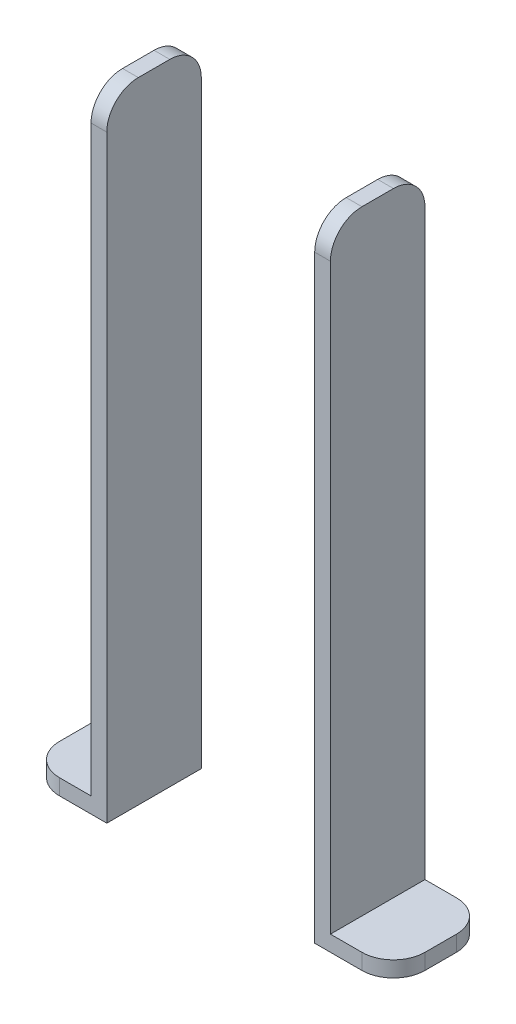
ISO-10303-21;
HEADER;
FILE_DESCRIPTION(('STEP AP214'),'2;1');
FILE_NAME('part.step','',(''),(''),'','','');
FILE_SCHEMA(('AUTOMOTIVE_DESIGN { 1 0 10303 214 1 1 1 1 }'));
ENDSEC;
DATA;
#1=APPLICATION_CONTEXT('core data for automotive mechanical design processes');
#2=APPLICATION_PROTOCOL_DEFINITION('international standard','automotive_design',2000,#1);
#3=PRODUCT_CONTEXT('',#1,'mechanical');
#4=PRODUCT('Part','Part','',(#3));
#5=PRODUCT_RELATED_PRODUCT_CATEGORY('part','',(#4));
#6=PRODUCT_DEFINITION_FORMATION('','',#4);
#7=PRODUCT_DEFINITION_CONTEXT('part definition',#1,'design');
#8=PRODUCT_DEFINITION('design','',#6,#7);
#9=PRODUCT_DEFINITION_SHAPE('','',#8);
#10=(LENGTH_UNIT() NAMED_UNIT(*) SI_UNIT(.MILLI.,.METRE.));
#11=(NAMED_UNIT(*) PLANE_ANGLE_UNIT() SI_UNIT($,.RADIAN.));
#12=(NAMED_UNIT(*) SI_UNIT($,.STERADIAN.) SOLID_ANGLE_UNIT());
#13=UNCERTAINTY_MEASURE_WITH_UNIT(LENGTH_MEASURE(1.E-05),#10,'distance_accuracy_value','');
#14=(GEOMETRIC_REPRESENTATION_CONTEXT(3) GLOBAL_UNCERTAINTY_ASSIGNED_CONTEXT((#13)) GLOBAL_UNIT_ASSIGNED_CONTEXT((#10,
#11,#12)) REPRESENTATION_CONTEXT('',''));
#15=CARTESIAN_POINT('',(0.,0.,0.));
#16=DIRECTION('',(0.,0.,1.));
#17=DIRECTION('',(1.,0.,0.));
#18=AXIS2_PLACEMENT_3D('',#15,#16,#17);
#19=CARTESIAN_POINT('',(-38.,-95.,-15.));
#20=DIRECTION('',(-1.,0.,0.));
#21=DIRECTION('',(0.,-1.,0.));
#22=AXIS2_PLACEMENT_3D('',#19,#20,#21);
#23=PLANE('',#22);
#24=DIRECTION('',(0.,0.,1.));
#25=VECTOR('',#24,1.);
#26=CARTESIAN_POINT('',(-38.,100.,-15.));
#27=LINE('',#26,#25);
#28=CARTESIAN_POINT('',(-38.,100.,-5.));
#29=VERTEX_POINT('',#28);
#30=CARTESIAN_POINT('',(-38.,100.,5.));
#31=VERTEX_POINT('',#30);
#32=EDGE_CURVE('E162',#29,#31,#27,.T.);
#33=ORIENTED_EDGE('',*,*,#32,.F.);
#34=CARTESIAN_POINT('',(-38.,90.,-5.));
#35=DIRECTION('',(-1.,0.,0.));
#36=DIRECTION('',(0.,-1.,0.));
#37=AXIS2_PLACEMENT_3D('',#34,#35,#36);
#38=CIRCLE('',#37,10.);
#39=CARTESIAN_POINT('',(-38.,90.,-15.));
#40=VERTEX_POINT('',#39);
#41=EDGE_CURVE('E198',#29,#40,#38,.T.);
#42=ORIENTED_EDGE('',*,*,#41,.T.);
#43=DIRECTION('',(0.,-1.,0.));
#44=VECTOR('',#43,1.);
#45=CARTESIAN_POINT('',(-38.,-95.,-15.));
#46=LINE('',#45,#44);
#47=CARTESIAN_POINT('',(-38.,-95.,-15.));
#48=VERTEX_POINT('',#47);
#49=EDGE_CURVE('E139',#40,#48,#46,.T.);
#50=ORIENTED_EDGE('',*,*,#49,.T.);
#51=DIRECTION('',(0.,0.,1.));
#52=VECTOR('',#51,1.);
#53=CARTESIAN_POINT('',(-38.,-95.,-15.));
#54=LINE('',#53,#52);
#55=CARTESIAN_POINT('',(-38.,-95.,15.));
#56=VERTEX_POINT('',#55);
#57=EDGE_CURVE('E136',#48,#56,#54,.T.);
#58=ORIENTED_EDGE('',*,*,#57,.T.);
#59=DIRECTION('',(0.,-1.,0.));
#60=VECTOR('',#59,1.);
#61=CARTESIAN_POINT('',(-38.,-95.,15.));
#62=LINE('',#61,#60);
#63=CARTESIAN_POINT('',(-38.,90.,15.));
#64=VERTEX_POINT('',#63);
#65=EDGE_CURVE('E123',#64,#56,#62,.T.);
#66=ORIENTED_EDGE('',*,*,#65,.F.);
#67=CARTESIAN_POINT('',(-38.,90.,5.));
#68=DIRECTION('',(-1.,0.,0.));
#69=DIRECTION('',(0.,-1.,0.));
#70=AXIS2_PLACEMENT_3D('',#67,#68,#69);
#71=CIRCLE('',#70,10.);
#72=EDGE_CURVE('E196',#64,#31,#71,.T.);
#73=ORIENTED_EDGE('',*,*,#72,.T.);
#74=EDGE_LOOP('',(#33,#42,#50,#58,#66,#73));
#75=FACE_BOUND('',#74,.T.);
#76=ADVANCED_FACE('F45',(#75),#23,.T.);
#77=CARTESIAN_POINT('',(-38.,100.,-15.));
#78=DIRECTION('',(0.,1.,0.));
#79=DIRECTION('',(0.,0.,1.));
#80=AXIS2_PLACEMENT_3D('',#77,#78,#79);
#81=PLANE('',#80);
#82=DIRECTION('',(0.,0.,1.));
#83=VECTOR('',#82,1.);
#84=CARTESIAN_POINT('',(-33.,100.,-15.));
#85=LINE('',#84,#83);
#86=CARTESIAN_POINT('',(-33.,100.,-5.));
#87=VERTEX_POINT('',#86);
#88=CARTESIAN_POINT('',(-33.,100.,5.));
#89=VERTEX_POINT('',#88);
#90=EDGE_CURVE('E165',#87,#89,#85,.T.);
#91=ORIENTED_EDGE('',*,*,#90,.F.);
#92=DIRECTION('',(-1.,0.,0.));
#93=VECTOR('',#92,1.);
#94=CARTESIAN_POINT('',(-38.,100.,-5.));
#95=LINE('',#94,#93);
#96=EDGE_CURVE('E193',#87,#29,#95,.T.);
#97=ORIENTED_EDGE('',*,*,#96,.T.);
#98=ORIENTED_EDGE('',*,*,#32,.T.);
#99=DIRECTION('',(-1.,0.,0.));
#100=VECTOR('',#99,1.);
#101=CARTESIAN_POINT('',(-33.,100.,5.));
#102=LINE('',#101,#100);
#103=EDGE_CURVE('E60',#31,#89,#102,.F.);
#104=ORIENTED_EDGE('',*,*,#103,.T.);
#105=EDGE_LOOP('',(#91,#97,#98,#104));
#106=FACE_BOUND('',#105,.T.);
#107=ADVANCED_FACE('F205',(#106),#81,.T.);
#108=CARTESIAN_POINT('',(-33.,100.,-15.));
#109=DIRECTION('',(1.,0.,0.));
#110=DIRECTION('',(0.,0.,-1.));
#111=AXIS2_PLACEMENT_3D('',#108,#109,#110);
#112=PLANE('',#111);
#113=DIRECTION('',(0.,1.,0.));
#114=VECTOR('',#113,1.);
#115=CARTESIAN_POINT('',(-33.,100.,-15.));
#116=LINE('',#115,#114);
#117=CARTESIAN_POINT('',(-33.,-100.,-15.));
#118=VERTEX_POINT('',#117);
#119=CARTESIAN_POINT('',(-33.,90.,-15.));
#120=VERTEX_POINT('',#119);
#121=EDGE_CURVE('E144',#118,#120,#116,.T.);
#122=ORIENTED_EDGE('',*,*,#121,.T.);
#123=CARTESIAN_POINT('',(-33.,90.,-5.));
#124=DIRECTION('',(1.,0.,0.));
#125=DIRECTION('',(0.,0.,-1.));
#126=AXIS2_PLACEMENT_3D('',#123,#124,#125);
#127=CIRCLE('',#126,10.);
#128=EDGE_CURVE('E12',#120,#87,#127,.T.);
#129=ORIENTED_EDGE('',*,*,#128,.T.);
#130=ORIENTED_EDGE('',*,*,#90,.T.);
#131=CARTESIAN_POINT('',(-33.,90.,5.));
#132=DIRECTION('',(1.,0.,0.));
#133=DIRECTION('',(0.,0.,-1.));
#134=AXIS2_PLACEMENT_3D('',#131,#132,#133);
#135=CIRCLE('',#134,10.);
#136=CARTESIAN_POINT('',(-33.,90.,15.));
#137=VERTEX_POINT('',#136);
#138=EDGE_CURVE('E53',#89,#137,#135,.T.);
#139=ORIENTED_EDGE('',*,*,#138,.T.);
#140=DIRECTION('',(0.,1.,0.));
#141=VECTOR('',#140,1.);
#142=CARTESIAN_POINT('',(-33.,100.,15.));
#143=LINE('',#142,#141);
#144=CARTESIAN_POINT('',(-33.,-100.,15.));
#145=VERTEX_POINT('',#144);
#146=EDGE_CURVE('E152',#145,#137,#143,.T.);
#147=ORIENTED_EDGE('',*,*,#146,.F.);
#148=DIRECTION('',(0.,0.,1.));
#149=VECTOR('',#148,1.);
#150=CARTESIAN_POINT('',(-33.,-100.,-15.));
#151=LINE('',#150,#149);
#152=EDGE_CURVE('E167',#118,#145,#151,.T.);
#153=ORIENTED_EDGE('',*,*,#152,.F.);
#154=EDGE_LOOP('',(#122,#129,#130,#139,#147,#153));
#155=FACE_BOUND('',#154,.T.);
#156=ADVANCED_FACE('F201',(#155),#112,.T.);
#157=CARTESIAN_POINT('',(-33.,-100.,-15.));
#158=DIRECTION('',(0.,-1.,0.));
#159=DIRECTION('',(1.,0.,0.));
#160=AXIS2_PLACEMENT_3D('',#157,#158,#159);
#161=PLANE('',#160);
#162=DIRECTION('',(0.,0.,1.));
#163=VECTOR('',#162,1.);
#164=CARTESIAN_POINT('',(-58.,-100.,-15.));
#165=LINE('',#164,#163);
#166=CARTESIAN_POINT('',(-58.,-100.,-5.));
#167=VERTEX_POINT('',#166);
#168=CARTESIAN_POINT('',(-58.,-100.,5.));
#169=VERTEX_POINT('',#168);
#170=EDGE_CURVE('E170',#167,#169,#165,.T.);
#171=ORIENTED_EDGE('',*,*,#170,.F.);
#172=CARTESIAN_POINT('',(-48.,-100.,-5.));
#173=DIRECTION('',(0.,-1.,0.));
#174=DIRECTION('',(1.,0.,0.));
#175=AXIS2_PLACEMENT_3D('',#172,#173,#174);
#176=CIRCLE('',#175,10.);
#177=CARTESIAN_POINT('',(-48.,-100.,-15.));
#178=VERTEX_POINT('',#177);
#179=EDGE_CURVE('E180',#167,#178,#176,.T.);
#180=ORIENTED_EDGE('',*,*,#179,.T.);
#181=DIRECTION('',(1.,0.,0.));
#182=VECTOR('',#181,1.);
#183=CARTESIAN_POINT('',(-33.,-100.,-15.));
#184=LINE('',#183,#182);
#185=EDGE_CURVE('E159',#178,#118,#184,.T.);
#186=ORIENTED_EDGE('',*,*,#185,.T.);
#187=ORIENTED_EDGE('',*,*,#152,.T.);
#188=DIRECTION('',(1.,0.,0.));
#189=VECTOR('',#188,1.);
#190=CARTESIAN_POINT('',(-33.,-100.,15.));
#191=LINE('',#190,#189);
#192=CARTESIAN_POINT('',(-48.,-100.,15.));
#193=VERTEX_POINT('',#192);
#194=EDGE_CURVE('E150',#193,#145,#191,.T.);
#195=ORIENTED_EDGE('',*,*,#194,.F.);
#196=CARTESIAN_POINT('',(-48.,-100.,5.));
#197=DIRECTION('',(0.,-1.,0.));
#198=DIRECTION('',(1.,0.,0.));
#199=AXIS2_PLACEMENT_3D('',#196,#197,#198);
#200=CIRCLE('',#199,10.);
#201=EDGE_CURVE('E178',#193,#169,#200,.T.);
#202=ORIENTED_EDGE('',*,*,#201,.T.);
#203=EDGE_LOOP('',(#171,#180,#186,#187,#195,#202));
#204=FACE_BOUND('',#203,.T.);
#205=ADVANCED_FACE('F225',(#204),#161,.T.);
#206=CARTESIAN_POINT('',(-58.,-100.,-15.));
#207=DIRECTION('',(-1.,0.,0.));
#208=DIRECTION('',(0.,-1.,0.));
#209=AXIS2_PLACEMENT_3D('',#206,#207,#208);
#210=PLANE('',#209);
#211=DIRECTION('',(0.,0.,1.));
#212=VECTOR('',#211,1.);
#213=CARTESIAN_POINT('',(-58.,-95.,-15.));
#214=LINE('',#213,#212);
#215=CARTESIAN_POINT('',(-58.,-95.,-5.));
#216=VERTEX_POINT('',#215);
#217=CARTESIAN_POINT('',(-58.,-95.,5.));
#218=VERTEX_POINT('',#217);
#219=EDGE_CURVE('E143',#216,#218,#214,.T.);
#220=ORIENTED_EDGE('',*,*,#219,.F.);
#221=DIRECTION('',(0.,-1.,0.));
#222=VECTOR('',#221,1.);
#223=CARTESIAN_POINT('',(-58.,-100.,-5.));
#224=LINE('',#223,#222);
#225=EDGE_CURVE('E175',#216,#167,#224,.T.);
#226=ORIENTED_EDGE('',*,*,#225,.T.);
#227=ORIENTED_EDGE('',*,*,#170,.T.);
#228=DIRECTION('',(0.,-1.,0.));
#229=VECTOR('',#228,1.);
#230=CARTESIAN_POINT('',(-58.,-95.,5.));
#231=LINE('',#230,#229);
#232=EDGE_CURVE('E164',#169,#218,#231,.F.);
#233=ORIENTED_EDGE('',*,*,#232,.T.);
#234=EDGE_LOOP('',(#220,#226,#227,#233));
#235=FACE_BOUND('',#234,.T.);
#236=ADVANCED_FACE('F222',(#235),#210,.T.);
#237=CARTESIAN_POINT('',(-58.,-95.,-15.));
#238=DIRECTION('',(0.,1.,0.));
#239=DIRECTION('',(0.,0.,1.));
#240=AXIS2_PLACEMENT_3D('',#237,#238,#239);
#241=PLANE('',#240);
#242=DIRECTION('',(-1.,0.,0.));
#243=VECTOR('',#242,1.);
#244=CARTESIAN_POINT('',(-58.,-95.,-15.));
#245=LINE('',#244,#243);
#246=CARTESIAN_POINT('',(-48.,-95.,-15.));
#247=VERTEX_POINT('',#246);
#248=EDGE_CURVE('E157',#48,#247,#245,.T.);
#249=ORIENTED_EDGE('',*,*,#248,.T.);
#250=CARTESIAN_POINT('',(-48.,-95.,-5.));
#251=DIRECTION('',(0.,1.,0.));
#252=DIRECTION('',(0.,0.,1.));
#253=AXIS2_PLACEMENT_3D('',#250,#251,#252);
#254=CIRCLE('',#253,10.);
#255=EDGE_CURVE('E187',#247,#216,#254,.T.);
#256=ORIENTED_EDGE('',*,*,#255,.T.);
#257=ORIENTED_EDGE('',*,*,#219,.T.);
#258=CARTESIAN_POINT('',(-48.,-95.,5.));
#259=DIRECTION('',(0.,1.,0.));
#260=DIRECTION('',(0.,0.,1.));
#261=AXIS2_PLACEMENT_3D('',#258,#259,#260);
#262=CIRCLE('',#261,10.);
#263=CARTESIAN_POINT('',(-48.,-95.,15.));
#264=VERTEX_POINT('',#263);
#265=EDGE_CURVE('E149',#218,#264,#262,.T.);
#266=ORIENTED_EDGE('',*,*,#265,.T.);
#267=DIRECTION('',(-1.,0.,0.));
#268=VECTOR('',#267,1.);
#269=CARTESIAN_POINT('',(-58.,-95.,15.));
#270=LINE('',#269,#268);
#271=EDGE_CURVE('E128',#56,#264,#270,.T.);
#272=ORIENTED_EDGE('',*,*,#271,.F.);
#273=ORIENTED_EDGE('',*,*,#57,.F.);
#274=EDGE_LOOP('',(#249,#256,#257,#266,#272,#273));
#275=FACE_BOUND('',#274,.T.);
#276=ADVANCED_FACE('F146',(#275),#241,.T.);
#277=CARTESIAN_POINT('',(0.,0.,-15.));
#278=DIRECTION('',(0.,0.,-1.));
#279=DIRECTION('',(-1.,0.,0.));
#280=AXIS2_PLACEMENT_3D('',#277,#278,#279);
#281=PLANE('',#280);
#282=ORIENTED_EDGE('',*,*,#185,.F.);
#283=DIRECTION('',(0.,-1.,0.));
#284=VECTOR('',#283,1.);
#285=CARTESIAN_POINT('',(-47.9999999999998,0.,-15.));
#286=LINE('',#285,#284);
#287=EDGE_CURVE('E184',#178,#247,#286,.F.);
#288=ORIENTED_EDGE('',*,*,#287,.T.);
#289=ORIENTED_EDGE('',*,*,#248,.F.);
#290=ORIENTED_EDGE('',*,*,#49,.F.);
#291=DIRECTION('',(-1.,0.,0.));
#292=VECTOR('',#291,1.);
#293=CARTESIAN_POINT('',(0.,90.,-15.));
#294=LINE('',#293,#292);
#295=EDGE_CURVE('E182',#40,#120,#294,.F.);
#296=ORIENTED_EDGE('',*,*,#295,.T.);
#297=ORIENTED_EDGE('',*,*,#121,.F.);
#298=EDGE_LOOP('',(#282,#288,#289,#290,#296,#297));
#299=FACE_BOUND('',#298,.T.);
#300=ADVANCED_FACE('F212',(#299),#281,.T.);
#301=CARTESIAN_POINT('',(0.,0.,15.));
#302=DIRECTION('',(0.,0.,-1.));
#303=DIRECTION('',(-1.,0.,0.));
#304=AXIS2_PLACEMENT_3D('',#301,#302,#303);
#305=PLANE('',#304);
#306=ORIENTED_EDGE('',*,*,#271,.T.);
#307=DIRECTION('',(0.,-1.,0.));
#308=VECTOR('',#307,1.);
#309=CARTESIAN_POINT('',(-48.,-100.,15.));
#310=LINE('',#309,#308);
#311=EDGE_CURVE('E190',#264,#193,#310,.T.);
#312=ORIENTED_EDGE('',*,*,#311,.T.);
#313=ORIENTED_EDGE('',*,*,#194,.T.);
#314=ORIENTED_EDGE('',*,*,#146,.T.);
#315=DIRECTION('',(-1.,0.,0.));
#316=VECTOR('',#315,1.);
#317=CARTESIAN_POINT('',(-38.,90.,15.));
#318=LINE('',#317,#316);
#319=EDGE_CURVE('E132',#137,#64,#318,.T.);
#320=ORIENTED_EDGE('',*,*,#319,.T.);
#321=ORIENTED_EDGE('',*,*,#65,.T.);
#322=EDGE_LOOP('',(#306,#312,#313,#314,#320,#321));
#323=FACE_BOUND('',#322,.T.);
#324=ADVANCED_FACE('F125',(#323),#305,.F.);
#325=CARTESIAN_POINT('',(-48.,-100.,-5.));
#326=DIRECTION('',(0.,-1.,0.));
#327=DIRECTION('',(1.,0.,0.));
#328=AXIS2_PLACEMENT_3D('',#325,#326,#327);
#329=CYLINDRICAL_SURFACE('',#328,10.);
#330=ORIENTED_EDGE('',*,*,#255,.F.);
#331=ORIENTED_EDGE('',*,*,#287,.F.);
#332=ORIENTED_EDGE('',*,*,#179,.F.);
#333=ORIENTED_EDGE('',*,*,#225,.F.);
#334=EDGE_LOOP('',(#330,#331,#332,#333));
#335=FACE_BOUND('',#334,.T.);
#336=ADVANCED_FACE('F219',(#335),#329,.T.);
#337=CARTESIAN_POINT('',(-47.9999999999998,0.,5.));
#338=DIRECTION('',(0.,1.,0.));
#339=DIRECTION('',(-1.,0.,0.));
#340=AXIS2_PLACEMENT_3D('',#337,#338,#339);
#341=CYLINDRICAL_SURFACE('',#340,10.);
#342=ORIENTED_EDGE('',*,*,#265,.F.);
#343=ORIENTED_EDGE('',*,*,#232,.F.);
#344=ORIENTED_EDGE('',*,*,#201,.F.);
#345=ORIENTED_EDGE('',*,*,#311,.F.);
#346=EDGE_LOOP('',(#342,#343,#344,#345));
#347=FACE_BOUND('',#346,.T.);
#348=ADVANCED_FACE('F227',(#347),#341,.T.);
#349=CARTESIAN_POINT('',(-38.,90.,-5.));
#350=DIRECTION('',(-1.,0.,0.));
#351=DIRECTION('',(0.,0.,1.));
#352=AXIS2_PLACEMENT_3D('',#349,#350,#351);
#353=CYLINDRICAL_SURFACE('',#352,10.);
#354=ORIENTED_EDGE('',*,*,#128,.F.);
#355=ORIENTED_EDGE('',*,*,#295,.F.);
#356=ORIENTED_EDGE('',*,*,#41,.F.);
#357=ORIENTED_EDGE('',*,*,#96,.F.);
#358=EDGE_LOOP('',(#354,#355,#356,#357));
#359=FACE_BOUND('',#358,.T.);
#360=ADVANCED_FACE('F208',(#359),#353,.T.);
#361=CARTESIAN_POINT('',(0.,90.,5.));
#362=DIRECTION('',(1.,0.,0.));
#363=DIRECTION('',(0.,0.,-1.));
#364=AXIS2_PLACEMENT_3D('',#361,#362,#363);
#365=CYLINDRICAL_SURFACE('',#364,10.);
#366=ORIENTED_EDGE('',*,*,#138,.F.);
#367=ORIENTED_EDGE('',*,*,#103,.F.);
#368=ORIENTED_EDGE('',*,*,#72,.F.);
#369=ORIENTED_EDGE('',*,*,#319,.F.);
#370=EDGE_LOOP('',(#366,#367,#368,#369));
#371=FACE_BOUND('',#370,.T.);
#372=ADVANCED_FACE('F47',(#371),#365,.T.);
#373=CLOSED_SHELL('',(#76,#107,#156,#205,#236,#276,#300,#324,#336,#348,#360,#372));
#374=MANIFOLD_SOLID_BREP('B2',#373);
#375=CARTESIAN_POINT('',(38.,100.,-15.));
#376=DIRECTION('',(0.,1.,0.));
#377=DIRECTION('',(0.,0.,1.));
#378=AXIS2_PLACEMENT_3D('',#375,#376,#377);
#379=PLANE('',#378);
#380=DIRECTION('',(0.,0.,1.));
#381=VECTOR('',#380,1.);
#382=CARTESIAN_POINT('',(38.,100.,-15.));
#383=LINE('',#382,#381);
#384=CARTESIAN_POINT('',(38.,100.,-5.));
#385=VERTEX_POINT('',#384);
#386=CARTESIAN_POINT('',(38.,100.,5.));
#387=VERTEX_POINT('',#386);
#388=EDGE_CURVE('E444',#385,#387,#383,.T.);
#389=ORIENTED_EDGE('',*,*,#388,.F.);
#390=DIRECTION('',(-1.,0.,0.));
#391=VECTOR('',#390,1.);
#392=CARTESIAN_POINT('',(33.,100.,-5.));
#393=LINE('',#392,#391);
#394=CARTESIAN_POINT('',(33.,100.,-5.));
#395=VERTEX_POINT('',#394);
#396=EDGE_CURVE('E474',#385,#395,#393,.T.);
#397=ORIENTED_EDGE('',*,*,#396,.T.);
#398=DIRECTION('',(0.,0.,1.));
#399=VECTOR('',#398,1.);
#400=CARTESIAN_POINT('',(33.,100.,-15.));
#401=LINE('',#400,#399);
#402=CARTESIAN_POINT('',(33.,100.,5.));
#403=VERTEX_POINT('',#402);
#404=EDGE_CURVE('E425',#395,#403,#401,.T.);
#405=ORIENTED_EDGE('',*,*,#404,.T.);
#406=DIRECTION('',(-1.,0.,0.));
#407=VECTOR('',#406,1.);
#408=CARTESIAN_POINT('',(38.,100.,5.));
#409=LINE('',#408,#407);
#410=EDGE_CURVE('E340',#403,#387,#409,.F.);
#411=ORIENTED_EDGE('',*,*,#410,.T.);
#412=EDGE_LOOP('',(#389,#397,#405,#411));
#413=FACE_BOUND('',#412,.T.);
#414=ADVANCED_FACE('F325',(#413),#379,.T.);
#415=CARTESIAN_POINT('',(38.,-95.,-15.));
#416=DIRECTION('',(1.,0.,0.));
#417=DIRECTION('',(0.,0.,-1.));
#418=AXIS2_PLACEMENT_3D('',#415,#416,#417);
#419=PLANE('',#418);
#420=DIRECTION('',(0.,1.,0.));
#421=VECTOR('',#420,1.);
#422=CARTESIAN_POINT('',(38.,-95.,-15.));
#423=LINE('',#422,#421);
#424=CARTESIAN_POINT('',(38.,-95.,-15.));
#425=VERTEX_POINT('',#424);
#426=CARTESIAN_POINT('',(38.,90.,-15.));
#427=VERTEX_POINT('',#426);
#428=EDGE_CURVE('E442',#425,#427,#423,.T.);
#429=ORIENTED_EDGE('',*,*,#428,.T.);
#430=CARTESIAN_POINT('',(38.,90.,-5.));
#431=DIRECTION('',(1.,0.,0.));
#432=DIRECTION('',(0.,0.,-1.));
#433=AXIS2_PLACEMENT_3D('',#430,#431,#432);
#434=CIRCLE('',#433,10.);
#435=EDGE_CURVE('E43',#427,#385,#434,.T.);
#436=ORIENTED_EDGE('',*,*,#435,.T.);
#437=ORIENTED_EDGE('',*,*,#388,.T.);
#438=CARTESIAN_POINT('',(38.,90.,5.));
#439=DIRECTION('',(1.,0.,0.));
#440=DIRECTION('',(0.,0.,-1.));
#441=AXIS2_PLACEMENT_3D('',#438,#439,#440);
#442=CIRCLE('',#441,10.);
#443=CARTESIAN_POINT('',(38.,90.,15.));
#444=VERTEX_POINT('',#443);
#445=EDGE_CURVE('E333',#387,#444,#442,.T.);
#446=ORIENTED_EDGE('',*,*,#445,.T.);
#447=DIRECTION('',(0.,1.,0.));
#448=VECTOR('',#447,1.);
#449=CARTESIAN_POINT('',(38.,-95.,15.));
#450=LINE('',#449,#448);
#451=CARTESIAN_POINT('',(38.,-95.,15.));
#452=VERTEX_POINT('',#451);
#453=EDGE_CURVE('E433',#452,#444,#450,.T.);
#454=ORIENTED_EDGE('',*,*,#453,.F.);
#455=DIRECTION('',(0.,0.,1.));
#456=VECTOR('',#455,1.);
#457=CARTESIAN_POINT('',(38.,-95.,-15.));
#458=LINE('',#457,#456);
#459=EDGE_CURVE('E447',#425,#452,#458,.T.);
#460=ORIENTED_EDGE('',*,*,#459,.F.);
#461=EDGE_LOOP('',(#429,#436,#437,#446,#454,#460));
#462=FACE_BOUND('',#461,.T.);
#463=ADVANCED_FACE('F482',(#462),#419,.T.);
#464=CARTESIAN_POINT('',(58.,-95.,-15.));
#465=DIRECTION('',(0.,1.,0.));
#466=DIRECTION('',(0.,0.,1.));
#467=AXIS2_PLACEMENT_3D('',#464,#465,#466);
#468=PLANE('',#467);
#469=DIRECTION('',(0.,0.,1.));
#470=VECTOR('',#469,1.);
#471=CARTESIAN_POINT('',(58.,-95.,-15.));
#472=LINE('',#471,#470);
#473=CARTESIAN_POINT('',(58.,-95.,-5.));
#474=VERTEX_POINT('',#473);
#475=CARTESIAN_POINT('',(58.,-95.,5.));
#476=VERTEX_POINT('',#475);
#477=EDGE_CURVE('E450',#474,#476,#472,.T.);
#478=ORIENTED_EDGE('',*,*,#477,.F.);
#479=CARTESIAN_POINT('',(48.,-95.,-5.));
#480=DIRECTION('',(0.,1.,0.));
#481=DIRECTION('',(0.,0.,1.));
#482=AXIS2_PLACEMENT_3D('',#479,#480,#481);
#483=CIRCLE('',#482,10.);
#484=CARTESIAN_POINT('',(48.,-95.,-15.));
#485=VERTEX_POINT('',#484);
#486=EDGE_CURVE('E461',#474,#485,#483,.T.);
#487=ORIENTED_EDGE('',*,*,#486,.T.);
#488=DIRECTION('',(-1.,0.,0.));
#489=VECTOR('',#488,1.);
#490=CARTESIAN_POINT('',(58.,-95.,-15.));
#491=LINE('',#490,#489);
#492=EDGE_CURVE('E440',#485,#425,#491,.T.);
#493=ORIENTED_EDGE('',*,*,#492,.T.);
#494=ORIENTED_EDGE('',*,*,#459,.T.);
#495=DIRECTION('',(-1.,0.,0.));
#496=VECTOR('',#495,1.);
#497=CARTESIAN_POINT('',(58.,-95.,15.));
#498=LINE('',#497,#496);
#499=CARTESIAN_POINT('',(48.,-95.,15.));
#500=VERTEX_POINT('',#499);
#501=EDGE_CURVE('E431',#500,#452,#498,.T.);
#502=ORIENTED_EDGE('',*,*,#501,.F.);
#503=CARTESIAN_POINT('',(48.,-95.,5.));
#504=DIRECTION('',(0.,1.,0.));
#505=DIRECTION('',(0.,0.,1.));
#506=AXIS2_PLACEMENT_3D('',#503,#504,#505);
#507=CIRCLE('',#506,10.);
#508=EDGE_CURVE('E459',#500,#476,#507,.T.);
#509=ORIENTED_EDGE('',*,*,#508,.T.);
#510=EDGE_LOOP('',(#478,#487,#493,#494,#502,#509));
#511=FACE_BOUND('',#510,.T.);
#512=ADVANCED_FACE('F505',(#511),#468,.T.);
#513=CARTESIAN_POINT('',(58.,-100.,-15.));
#514=DIRECTION('',(1.,0.,0.));
#515=DIRECTION('',(0.,1.,0.));
#516=AXIS2_PLACEMENT_3D('',#513,#514,#515);
#517=PLANE('',#516);
#518=DIRECTION('',(0.,0.,1.));
#519=VECTOR('',#518,1.);
#520=CARTESIAN_POINT('',(58.,-100.,-15.));
#521=LINE('',#520,#519);
#522=CARTESIAN_POINT('',(58.,-100.,-5.));
#523=VERTEX_POINT('',#522);
#524=CARTESIAN_POINT('',(58.,-100.,5.));
#525=VERTEX_POINT('',#524);
#526=EDGE_CURVE('E424',#523,#525,#521,.T.);
#527=ORIENTED_EDGE('',*,*,#526,.F.);
#528=DIRECTION('',(0.,1.,0.));
#529=VECTOR('',#528,1.);
#530=CARTESIAN_POINT('',(58.,-95.,-5.));
#531=LINE('',#530,#529);
#532=EDGE_CURVE('E456',#523,#474,#531,.T.);
#533=ORIENTED_EDGE('',*,*,#532,.T.);
#534=ORIENTED_EDGE('',*,*,#477,.T.);
#535=DIRECTION('',(0.,1.,0.));
#536=VECTOR('',#535,1.);
#537=CARTESIAN_POINT('',(58.,-100.,5.));
#538=LINE('',#537,#536);
#539=EDGE_CURVE('E446',#476,#525,#538,.F.);
#540=ORIENTED_EDGE('',*,*,#539,.T.);
#541=EDGE_LOOP('',(#527,#533,#534,#540));
#542=FACE_BOUND('',#541,.T.);
#543=ADVANCED_FACE('F502',(#542),#517,.T.);
#544=CARTESIAN_POINT('',(33.,-100.,-15.));
#545=DIRECTION('',(0.,-1.,0.));
#546=DIRECTION('',(0.,0.,-1.));
#547=AXIS2_PLACEMENT_3D('',#544,#545,#546);
#548=PLANE('',#547);
#549=DIRECTION('',(1.,0.,0.));
#550=VECTOR('',#549,1.);
#551=CARTESIAN_POINT('',(33.,-100.,-15.));
#552=LINE('',#551,#550);
#553=CARTESIAN_POINT('',(33.,-100.,-15.));
#554=VERTEX_POINT('',#553);
#555=CARTESIAN_POINT('',(48.,-100.,-15.));
#556=VERTEX_POINT('',#555);
#557=EDGE_CURVE('E438',#554,#556,#552,.T.);
#558=ORIENTED_EDGE('',*,*,#557,.T.);
#559=CARTESIAN_POINT('',(48.,-100.,-5.));
#560=DIRECTION('',(0.,-1.,0.));
#561=DIRECTION('',(0.,0.,-1.));
#562=AXIS2_PLACEMENT_3D('',#559,#560,#561);
#563=CIRCLE('',#562,10.);
#564=EDGE_CURVE('E468',#556,#523,#563,.T.);
#565=ORIENTED_EDGE('',*,*,#564,.T.);
#566=ORIENTED_EDGE('',*,*,#526,.T.);
#567=CARTESIAN_POINT('',(48.,-100.,5.));
#568=DIRECTION('',(0.,-1.,0.));
#569=DIRECTION('',(0.,0.,-1.));
#570=AXIS2_PLACEMENT_3D('',#567,#568,#569);
#571=CIRCLE('',#570,10.);
#572=CARTESIAN_POINT('',(48.,-100.,15.));
#573=VERTEX_POINT('',#572);
#574=EDGE_CURVE('E430',#525,#573,#571,.T.);
#575=ORIENTED_EDGE('',*,*,#574,.T.);
#576=DIRECTION('',(1.,0.,0.));
#577=VECTOR('',#576,1.);
#578=CARTESIAN_POINT('',(33.,-100.,15.));
#579=LINE('',#578,#577);
#580=CARTESIAN_POINT('',(33.,-100.,15.));
#581=VERTEX_POINT('',#580);
#582=EDGE_CURVE('E408',#581,#573,#579,.T.);
#583=ORIENTED_EDGE('',*,*,#582,.F.);
#584=DIRECTION('',(0.,0.,1.));
#585=VECTOR('',#584,1.);
#586=CARTESIAN_POINT('',(33.,-100.,-15.));
#587=LINE('',#586,#585);
#588=EDGE_CURVE('E416',#554,#581,#587,.T.);
#589=ORIENTED_EDGE('',*,*,#588,.F.);
#590=EDGE_LOOP('',(#558,#565,#566,#575,#583,#589));
#591=FACE_BOUND('',#590,.T.);
#592=ADVANCED_FACE('F427',(#591),#548,.T.);
#593=CARTESIAN_POINT('',(33.,100.,-15.));
#594=DIRECTION('',(-1.,0.,0.));
#595=DIRECTION('',(0.,0.,1.));
#596=AXIS2_PLACEMENT_3D('',#593,#594,#595);
#597=PLANE('',#596);
#598=ORIENTED_EDGE('',*,*,#404,.F.);
#599=CARTESIAN_POINT('',(33.,90.,-5.));
#600=DIRECTION('',(-1.,0.,0.));
#601=DIRECTION('',(0.,0.,1.));
#602=AXIS2_PLACEMENT_3D('',#599,#600,#601);
#603=CIRCLE('',#602,10.);
#604=CARTESIAN_POINT('',(33.,90.,-15.));
#605=VERTEX_POINT('',#604);
#606=EDGE_CURVE('E479',#395,#605,#603,.T.);
#607=ORIENTED_EDGE('',*,*,#606,.T.);
#608=DIRECTION('',(0.,-1.,0.));
#609=VECTOR('',#608,1.);
#610=CARTESIAN_POINT('',(33.,100.,-15.));
#611=LINE('',#610,#609);
#612=EDGE_CURVE('E420',#605,#554,#611,.T.);
#613=ORIENTED_EDGE('',*,*,#612,.T.);
#614=ORIENTED_EDGE('',*,*,#588,.T.);
#615=DIRECTION('',(0.,-1.,0.));
#616=VECTOR('',#615,1.);
#617=CARTESIAN_POINT('',(33.,100.,15.));
#618=LINE('',#617,#616);
#619=CARTESIAN_POINT('',(33.,90.,15.));
#620=VERTEX_POINT('',#619);
#621=EDGE_CURVE('E403',#620,#581,#618,.T.);
#622=ORIENTED_EDGE('',*,*,#621,.F.);
#623=CARTESIAN_POINT('',(33.,90.,5.));
#624=DIRECTION('',(-1.,0.,0.));
#625=DIRECTION('',(0.,0.,1.));
#626=AXIS2_PLACEMENT_3D('',#623,#624,#625);
#627=CIRCLE('',#626,10.);
#628=EDGE_CURVE('E477',#620,#403,#627,.T.);
#629=ORIENTED_EDGE('',*,*,#628,.T.);
#630=EDGE_LOOP('',(#598,#607,#613,#614,#622,#629));
#631=FACE_BOUND('',#630,.T.);
#632=ADVANCED_FACE('F418',(#631),#597,.T.);
#633=CARTESIAN_POINT('',(0.,0.,-15.));
#634=DIRECTION('',(0.,0.,1.));
#635=DIRECTION('',(1.,0.,0.));
#636=AXIS2_PLACEMENT_3D('',#633,#634,#635);
#637=PLANE('',#636);
#638=ORIENTED_EDGE('',*,*,#492,.F.);
#639=DIRECTION('',(0.,1.,0.));
#640=VECTOR('',#639,1.);
#641=CARTESIAN_POINT('',(48.,-100.,-15.));
#642=LINE('',#641,#640);
#643=EDGE_CURVE('E465',#485,#556,#642,.F.);
#644=ORIENTED_EDGE('',*,*,#643,.T.);
#645=ORIENTED_EDGE('',*,*,#557,.F.);
#646=ORIENTED_EDGE('',*,*,#612,.F.);
#647=DIRECTION('',(-1.,0.,0.));
#648=VECTOR('',#647,1.);
#649=CARTESIAN_POINT('',(38.,90.,-15.));
#650=LINE('',#649,#648);
#651=EDGE_CURVE('E463',#605,#427,#650,.F.);
#652=ORIENTED_EDGE('',*,*,#651,.T.);
#653=ORIENTED_EDGE('',*,*,#428,.F.);
#654=EDGE_LOOP('',(#638,#644,#645,#646,#652,#653));
#655=FACE_BOUND('',#654,.T.);
#656=ADVANCED_FACE('F492',(#655),#637,.F.);
#657=CARTESIAN_POINT('',(0.,0.,15.));
#658=DIRECTION('',(0.,0.,1.));
#659=DIRECTION('',(1.,0.,0.));
#660=AXIS2_PLACEMENT_3D('',#657,#658,#659);
#661=PLANE('',#660);
#662=ORIENTED_EDGE('',*,*,#582,.T.);
#663=DIRECTION('',(0.,1.,0.));
#664=VECTOR('',#663,1.);
#665=CARTESIAN_POINT('',(47.9999999999999,0.,15.));
#666=LINE('',#665,#664);
#667=EDGE_CURVE('E471',#573,#500,#666,.T.);
#668=ORIENTED_EDGE('',*,*,#667,.T.);
#669=ORIENTED_EDGE('',*,*,#501,.T.);
#670=ORIENTED_EDGE('',*,*,#453,.T.);
#671=DIRECTION('',(-1.,0.,0.));
#672=VECTOR('',#671,1.);
#673=CARTESIAN_POINT('',(0.,90.,15.));
#674=LINE('',#673,#672);
#675=EDGE_CURVE('E412',#444,#620,#674,.T.);
#676=ORIENTED_EDGE('',*,*,#675,.T.);
#677=ORIENTED_EDGE('',*,*,#621,.T.);
#678=EDGE_LOOP('',(#662,#668,#669,#670,#676,#677));
#679=FACE_BOUND('',#678,.T.);
#680=ADVANCED_FACE('F405',(#679),#661,.T.);
#681=CARTESIAN_POINT('',(48.,-100.,-5.));
#682=DIRECTION('',(0.,-1.,0.));
#683=DIRECTION('',(1.,0.,0.));
#684=AXIS2_PLACEMENT_3D('',#681,#682,#683);
#685=CYLINDRICAL_SURFACE('',#684,10.);
#686=ORIENTED_EDGE('',*,*,#564,.F.);
#687=ORIENTED_EDGE('',*,*,#643,.F.);
#688=ORIENTED_EDGE('',*,*,#486,.F.);
#689=ORIENTED_EDGE('',*,*,#532,.F.);
#690=EDGE_LOOP('',(#686,#687,#688,#689));
#691=FACE_BOUND('',#690,.T.);
#692=ADVANCED_FACE('F499',(#691),#685,.T.);
#693=CARTESIAN_POINT('',(47.9999999999999,0.,5.));
#694=DIRECTION('',(0.,1.,0.));
#695=DIRECTION('',(-1.,0.,0.));
#696=AXIS2_PLACEMENT_3D('',#693,#694,#695);
#697=CYLINDRICAL_SURFACE('',#696,10.);
#698=ORIENTED_EDGE('',*,*,#574,.F.);
#699=ORIENTED_EDGE('',*,*,#539,.F.);
#700=ORIENTED_EDGE('',*,*,#508,.F.);
#701=ORIENTED_EDGE('',*,*,#667,.F.);
#702=EDGE_LOOP('',(#698,#699,#700,#701));
#703=FACE_BOUND('',#702,.T.);
#704=ADVANCED_FACE('F507',(#703),#697,.T.);
#705=CARTESIAN_POINT('',(38.,90.,-5.));
#706=DIRECTION('',(1.,0.,0.));
#707=DIRECTION('',(0.,0.,-1.));
#708=AXIS2_PLACEMENT_3D('',#705,#706,#707);
#709=CYLINDRICAL_SURFACE('',#708,10.);
#710=ORIENTED_EDGE('',*,*,#435,.F.);
#711=ORIENTED_EDGE('',*,*,#651,.F.);
#712=ORIENTED_EDGE('',*,*,#606,.F.);
#713=ORIENTED_EDGE('',*,*,#396,.F.);
#714=EDGE_LOOP('',(#710,#711,#712,#713));
#715=FACE_BOUND('',#714,.T.);
#716=ADVANCED_FACE('F488',(#715),#709,.T.);
#717=CARTESIAN_POINT('',(0.,90.,5.));
#718=DIRECTION('',(-1.,0.,0.));
#719=DIRECTION('',(0.,0.,1.));
#720=AXIS2_PLACEMENT_3D('',#717,#718,#719);
#721=CYLINDRICAL_SURFACE('',#720,10.);
#722=ORIENTED_EDGE('',*,*,#445,.F.);
#723=ORIENTED_EDGE('',*,*,#410,.F.);
#724=ORIENTED_EDGE('',*,*,#628,.F.);
#725=ORIENTED_EDGE('',*,*,#675,.F.);
#726=EDGE_LOOP('',(#722,#723,#724,#725));
#727=FACE_BOUND('',#726,.T.);
#728=ADVANCED_FACE('F327',(#727),#721,.T.);
#729=CLOSED_SHELL('',(#414,#463,#512,#543,#592,#632,#656,#680,#692,#704,#716,#728));
#730=MANIFOLD_SOLID_BREP('B6',#729);
#731=ADVANCED_BREP_SHAPE_REPRESENTATION('',(#18,#374,#730),#14);
#732=SHAPE_DEFINITION_REPRESENTATION(#9,#731);
ENDSEC;
END-ISO-10303-21;
